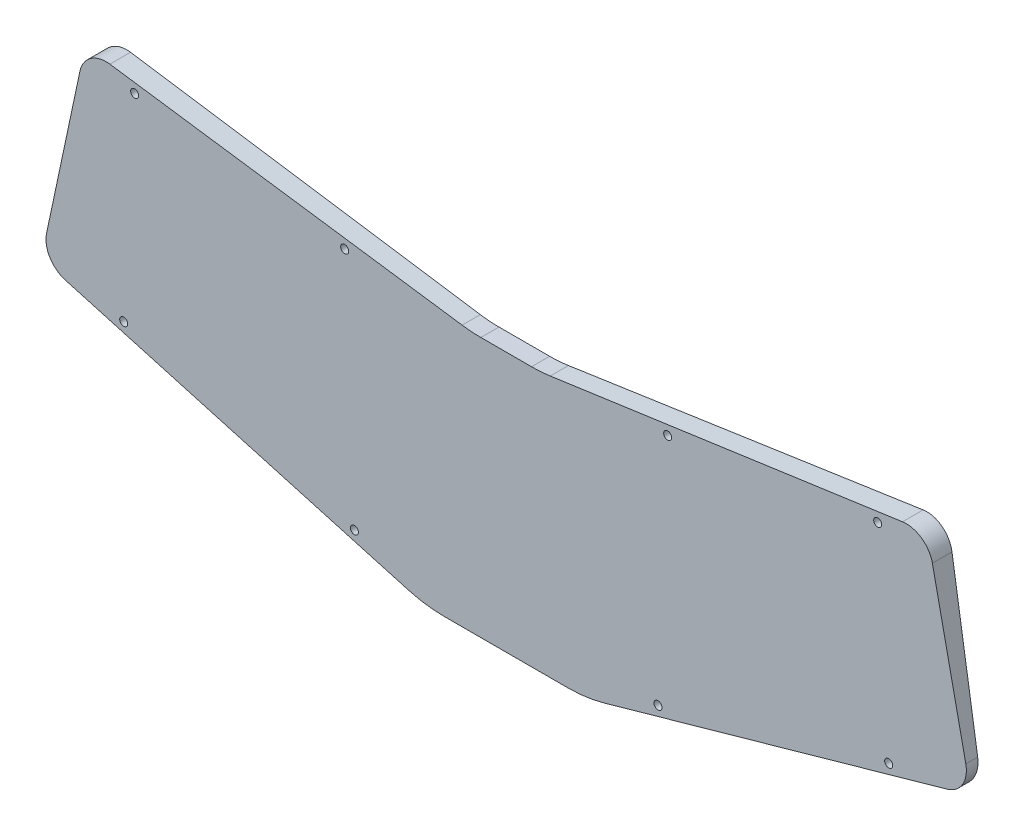
ISO-10303-21;
HEADER;
FILE_DESCRIPTION(('STEP AP214'),'2;1');
FILE_NAME('part.step','',(''),(''),'','','');
FILE_SCHEMA(('AUTOMOTIVE_DESIGN { 1 0 10303 214 1 1 1 1 }'));
ENDSEC;
DATA;
#1=APPLICATION_CONTEXT('core data for automotive mechanical design processes');
#2=APPLICATION_PROTOCOL_DEFINITION('international standard','automotive_design',2000,#1);
#3=PRODUCT_CONTEXT('',#1,'mechanical');
#4=PRODUCT('Part','Part','',(#3));
#5=PRODUCT_RELATED_PRODUCT_CATEGORY('part','',(#4));
#6=PRODUCT_DEFINITION_FORMATION('','',#4);
#7=PRODUCT_DEFINITION_CONTEXT('part definition',#1,'design');
#8=PRODUCT_DEFINITION('design','',#6,#7);
#9=PRODUCT_DEFINITION_SHAPE('','',#8);
#10=(LENGTH_UNIT() NAMED_UNIT(*) SI_UNIT(.MILLI.,.METRE.));
#11=(NAMED_UNIT(*) PLANE_ANGLE_UNIT() SI_UNIT($,.RADIAN.));
#12=(NAMED_UNIT(*) SI_UNIT($,.STERADIAN.) SOLID_ANGLE_UNIT());
#13=UNCERTAINTY_MEASURE_WITH_UNIT(LENGTH_MEASURE(1.E-05),#10,'distance_accuracy_value','');
#14=(GEOMETRIC_REPRESENTATION_CONTEXT(3) GLOBAL_UNCERTAINTY_ASSIGNED_CONTEXT((#13)) GLOBAL_UNIT_ASSIGNED_CONTEXT((#10,
#11,#12)) REPRESENTATION_CONTEXT('',''));
#15=CARTESIAN_POINT('',(0.,0.,0.));
#16=DIRECTION('',(0.,0.,1.));
#17=DIRECTION('',(1.,0.,0.));
#18=AXIS2_PLACEMENT_3D('',#15,#16,#17);
#19=CARTESIAN_POINT('',(150.648829756293,105.6337718,8.));
#20=DIRECTION('',(0.,0.,-1.));
#21=DIRECTION('',(-1.,0.,0.));
#22=AXIS2_PLACEMENT_3D('',#19,#20,#21);
#23=CYLINDRICAL_SURFACE('',#22,50.0000000000001);
#24=DIRECTION('',(0.,0.,-1.));
#25=VECTOR('',#24,1.);
#26=CARTESIAN_POINT('',(150.648829756293,55.6337718,8.));
#27=LINE('',#26,#25);
#28=CARTESIAN_POINT('',(150.648829756293,55.6337718,8.));
#29=VERTEX_POINT('',#28);
#30=CARTESIAN_POINT('',(150.648829756293,55.6337718,1.22268058038461));
#31=VERTEX_POINT('',#30);
#32=EDGE_CURVE('E298',#29,#31,#27,.T.);
#33=ORIENTED_EDGE('',*,*,#32,.T.);
#34=CARTESIAN_POINT('',(150.648829756293,105.6337718,-1.23374664074557));
#35=DIRECTION('',(0.,-0.0490693628638656,-0.998795373251265));
#36=DIRECTION('',(0.,0.998795373251265,-0.0490693628638656));
#37=AXIS2_PLACEMENT_3D('',#34,#35,#36);
#38=ELLIPSE('',#37,50.0603039812257,50.0000000000001);
#39=CARTESIAN_POINT('',(143.638789620378,56.1276172604596,1.19841867174252));
#40=VERTEX_POINT('',#39);
#41=EDGE_CURVE('E56',#31,#40,#38,.T.);
#42=ORIENTED_EDGE('',*,*,#41,.T.);
#43=DIRECTION('',(0.,0.,-1.));
#44=VECTOR('',#43,1.);
#45=CARTESIAN_POINT('',(143.638789620378,56.1276172604596,8.));
#46=LINE('',#45,#44);
#47=CARTESIAN_POINT('',(143.638789620378,56.1276172604596,8.));
#48=VERTEX_POINT('',#47);
#49=EDGE_CURVE('E11',#48,#40,#46,.T.);
#50=ORIENTED_EDGE('',*,*,#49,.F.);
#51=CARTESIAN_POINT('',(150.648829756293,105.6337718,8.));
#52=DIRECTION('',(0.,0.,1.));
#53=DIRECTION('',(1.,0.,0.));
#54=AXIS2_PLACEMENT_3D('',#51,#52,#53);
#55=CIRCLE('',#54,50.0000000000001);
#56=EDGE_CURVE('E242',#48,#29,#55,.T.);
#57=ORIENTED_EDGE('',*,*,#56,.T.);
#58=EDGE_LOOP('',(#33,#42,#50,#57));
#59=FACE_BOUND('',#58,.T.);
#60=ADVANCED_FACE('F41',(#59),#23,.F.);
#61=CARTESIAN_POINT('',(10.6148163678907,74.9637276433423,8.));
#62=DIRECTION('',(-0.140200802718302,-0.990123090790809,0.));
#63=DIRECTION('',(0.990123090790809,-0.140200802718302,0.));
#64=AXIS2_PLACEMENT_3D('',#61,#62,#63);
#65=PLANE('',#64);
#66=DIRECTION('',(0.990099604602698,-0.140197477088937,0.00688769798110076));
#67=VECTOR('',#66,1.);
#68=CARTESIAN_POINT('',(10.6675105079973,74.9562661864687,0.273394556563476));
#69=LINE('',#68,#67);
#70=CARTESIAN_POINT('',(11.8710516632766,74.7858455209533,0.281767075799776));
#71=VERTEX_POINT('',#70);
#72=EDGE_CURVE('E210',#71,#40,#69,.T.);
#73=ORIENTED_EDGE('',*,*,#72,.F.);
#74=DIRECTION('',(0.,0.,-1.));
#75=VECTOR('',#74,1.);
#76=CARTESIAN_POINT('',(11.8710516632766,74.7858455209533,8.));
#77=LINE('',#76,#75);
#78=CARTESIAN_POINT('',(11.8710516632766,74.7858455209533,8.));
#79=VERTEX_POINT('',#78);
#80=EDGE_CURVE('E49',#79,#71,#77,.T.);
#81=ORIENTED_EDGE('',*,*,#80,.F.);
#82=DIRECTION('',(-0.990123090790809,0.140200802718302,0.));
#83=VECTOR('',#82,1.);
#84=CARTESIAN_POINT('',(10.6148163678907,74.9637276433423,8.));
#85=LINE('',#84,#83);
#86=EDGE_CURVE('E209',#48,#79,#85,.T.);
#87=ORIENTED_EDGE('',*,*,#86,.F.);
#88=ORIENTED_EDGE('',*,*,#49,.T.);
#89=EDGE_LOOP('',(#73,#81,#87,#88));
#90=FACE_BOUND('',#89,.T.);
#91=ADVANCED_FACE('F208',(#90),#65,.F.);
#92=CARTESIAN_POINT('',(10.4690436360936,64.8846146130453,8.));
#93=DIRECTION('',(0.,0.,-1.));
#94=DIRECTION('',(-1.,0.,0.));
#95=AXIS2_PLACEMENT_3D('',#92,#93,#94);
#96=CYLINDRICAL_SURFACE('',#95,10.);
#97=CARTESIAN_POINT('',(10.4690436360936,64.8846146130453,0.768200138297392));
#98=DIRECTION('',(0.,-0.0490693628638656,-0.998795373251265));
#99=DIRECTION('',(0.,0.998795373251265,-0.0490693628638656));
#100=AXIS2_PLACEMENT_3D('',#97,#98,#99);
#101=ELLIPSE('',#100,10.0120607962451,10.);
#102=CARTESIAN_POINT('',(0.687567626638668,66.9637315112637,0.666056151403481));
#103=VERTEX_POINT('',#102);
#104=EDGE_CURVE('E203',#103,#71,#101,.T.);
#105=ORIENTED_EDGE('',*,*,#104,.F.);
#106=DIRECTION('',(0.,0.,-1.));
#107=VECTOR('',#106,1.);
#108=CARTESIAN_POINT('',(0.687567626638668,66.9637315112637,8.));
#109=LINE('',#108,#107);
#110=CARTESIAN_POINT('',(0.687567626638668,66.9637315112637,8.));
#111=VERTEX_POINT('',#110);
#112=EDGE_CURVE('E193',#111,#103,#109,.T.);
#113=ORIENTED_EDGE('',*,*,#112,.F.);
#114=CARTESIAN_POINT('',(10.4690436360936,64.8846146130453,8.));
#115=DIRECTION('',(0.,0.,1.));
#116=DIRECTION('',(1.,0.,0.));
#117=AXIS2_PLACEMENT_3D('',#114,#115,#116);
#118=CIRCLE('',#117,10.);
#119=EDGE_CURVE('E204',#79,#111,#118,.T.);
#120=ORIENTED_EDGE('',*,*,#119,.F.);
#121=ORIENTED_EDGE('',*,*,#80,.T.);
#122=EDGE_LOOP('',(#105,#113,#120,#121));
#123=FACE_BOUND('',#122,.T.);
#124=ADVANCED_FACE('F201',(#123),#96,.T.);
#125=CARTESIAN_POINT('',(-12.9604556644015,2.75482987990983,8.));
#126=DIRECTION('',(-0.978147600945494,0.207911689821841,0.));
#127=DIRECTION('',(-0.207911689821841,-0.978147600945495,0.));
#128=AXIS2_PLACEMENT_3D('',#125,#126,#127);
#129=PLANE('',#128);
#130=ORIENTED_EDGE('',*,*,#112,.T.);
#131=DIRECTION('',(-0.20767204165615,-0.977020144963858,0.0479995775936354));
#132=VECTOR('',#131,1.);
#133=CARTESIAN_POINT('',(-13.0021171732661,2.55882788991781,3.83017531999826));
#134=LINE('',#133,#132);
#135=CARTESIAN_POINT('',(-11.8075093074083,8.17901605278993,3.55406365617521));
#136=VERTEX_POINT('',#135);
#137=EDGE_CURVE('E212',#103,#136,#134,.T.);
#138=ORIENTED_EDGE('',*,*,#137,.T.);
#139=DIRECTION('',(0.,0.,-1.));
#140=VECTOR('',#139,1.);
#141=CARTESIAN_POINT('',(-11.8075093074083,8.17901605278993,8.));
#142=LINE('',#141,#140);
#143=CARTESIAN_POINT('',(-11.8075093074083,8.17901605278993,8.));
#144=VERTEX_POINT('',#143);
#145=EDGE_CURVE('E190',#144,#136,#142,.T.);
#146=ORIENTED_EDGE('',*,*,#145,.F.);
#147=DIRECTION('',(0.207911689821841,0.978147600945495,0.));
#148=VECTOR('',#147,1.);
#149=CARTESIAN_POINT('',(-12.9604556644015,2.75482987990983,8.));
#150=LINE('',#149,#148);
#151=EDGE_CURVE('E247',#144,#111,#150,.T.);
#152=ORIENTED_EDGE('',*,*,#151,.T.);
#153=EDGE_LOOP('',(#130,#138,#146,#152));
#154=FACE_BOUND('',#153,.T.);
#155=ADVANCED_FACE('F398',(#154),#129,.T.);
#156=CARTESIAN_POINT('',(-2.02603329795333,6.09989915457152,8.));
#157=DIRECTION('',(0.,0.,-1.));
#158=DIRECTION('',(-1.,0.,0.));
#159=AXIS2_PLACEMENT_3D('',#156,#157,#158);
#160=CYLINDRICAL_SURFACE('',#159,10.);
#161=ORIENTED_EDGE('',*,*,#145,.T.);
#162=CARTESIAN_POINT('',(-2.02603329795333,6.09989915457152,3.65620764306912));
#163=DIRECTION('',(0.,-0.0490693628638656,-0.998795373251265));
#164=DIRECTION('',(0.,0.998795373251265,-0.0490693628638656));
#165=AXIS2_PLACEMENT_3D('',#162,#163,#164);
#166=ELLIPSE('',#165,10.0120607962451,10.);
#167=CARTESIAN_POINT('',(-4.7435049807062,-3.52378764693216,4.12900536760602));
#168=VERTEX_POINT('',#167);
#169=EDGE_CURVE('E219',#168,#136,#166,.T.);
#170=ORIENTED_EDGE('',*,*,#169,.F.);
#171=DIRECTION('',(0.,0.,-1.));
#172=VECTOR('',#171,1.);
#173=CARTESIAN_POINT('',(-4.7435049807062,-3.52378764693216,8.));
#174=LINE('',#173,#172);
#175=CARTESIAN_POINT('',(-4.7435049807062,-3.52378764693216,8.));
#176=VERTEX_POINT('',#175);
#177=EDGE_CURVE('E182',#176,#168,#174,.T.);
#178=ORIENTED_EDGE('',*,*,#177,.F.);
#179=CARTESIAN_POINT('',(-2.02603329795333,6.09989915457152,8.));
#180=DIRECTION('',(0.,0.,1.));
#181=DIRECTION('',(1.,0.,0.));
#182=AXIS2_PLACEMENT_3D('',#179,#180,#181);
#183=CIRCLE('',#182,10.);
#184=EDGE_CURVE('E250',#144,#176,#183,.T.);
#185=ORIENTED_EDGE('',*,*,#184,.F.);
#186=EDGE_LOOP('',(#161,#170,#178,#185));
#187=FACE_BOUND('',#186,.T.);
#188=ADVANCED_FACE('F396',(#187),#160,.T.);
#189=CARTESIAN_POINT('',(-1.27183569305309,-4.50409417349183,8.));
#190=DIRECTION('',(0.271747168275288,0.962368680150368,0.));
#191=DIRECTION('',(-0.962368680150369,0.271747168275288,0.));
#192=AXIS2_PLACEMENT_3D('',#189,#190,#191);
#193=PLANE('',#192);
#194=DIRECTION('',(-0.962282926763274,0.271722953813,-0.013349353207043));
#195=VECTOR('',#194,1.);
#196=CARTESIAN_POINT('',(-1.22272812818722,-4.517960835997,4.17784764928875));
#197=LINE('',#196,#195);
#198=CARTESIAN_POINT('',(123.463014033061,-39.7258786075184,5.90756140155431));
#199=VERTEX_POINT('',#198);
#200=EDGE_CURVE('E176',#199,#168,#197,.T.);
#201=ORIENTED_EDGE('',*,*,#200,.F.);
#202=DIRECTION('',(0.,0.,-1.));
#203=VECTOR('',#202,1.);
#204=CARTESIAN_POINT('',(123.46301403306,-39.7258786075184,8.));
#205=LINE('',#204,#203);
#206=CARTESIAN_POINT('',(123.46301403306,-39.7258786075184,8.));
#207=VERTEX_POINT('',#206);
#208=EDGE_CURVE('E174',#207,#199,#205,.T.);
#209=ORIENTED_EDGE('',*,*,#208,.F.);
#210=DIRECTION('',(0.962368680150369,-0.271747168275288,0.));
#211=VECTOR('',#210,1.);
#212=CARTESIAN_POINT('',(-1.27183569305309,-4.50409417349183,8.));
#213=LINE('',#212,#211);
#214=EDGE_CURVE('E252',#176,#207,#213,.T.);
#215=ORIENTED_EDGE('',*,*,#214,.F.);
#216=ORIENTED_EDGE('',*,*,#177,.T.);
#217=EDGE_LOOP('',(#201,#209,#215,#216));
#218=FACE_BOUND('',#217,.T.);
#219=ADVANCED_FACE('F393',(#218),#193,.F.);
#220=CARTESIAN_POINT('',(137.050372446825,8.39255540000002,8.));
#221=DIRECTION('',(0.,0.,-1.));
#222=DIRECTION('',(-1.,0.,0.));
#223=AXIS2_PLACEMENT_3D('',#220,#221,#222);
#224=CYLINDRICAL_SURFACE('',#223,50.);
#225=CARTESIAN_POINT('',(137.050372446825,8.39255540000002,3.54357277886983));
#226=DIRECTION('',(0.,-0.0490693628638656,-0.998795373251265));
#227=DIRECTION('',(0.,0.998795373251265,-0.0490693628638656));
#228=AXIS2_PLACEMENT_3D('',#225,#226,#227);
#229=ELLIPSE('',#228,50.0603039812256,50.);
#230=CARTESIAN_POINT('',(137.050372446825,-41.6074446,6.));
#231=VERTEX_POINT('',#230);
#232=EDGE_CURVE('E157',#231,#199,#229,.T.);
#233=ORIENTED_EDGE('',*,*,#232,.F.);
#234=DIRECTION('',(0.,0.,-1.));
#235=VECTOR('',#234,1.);
#236=CARTESIAN_POINT('',(137.050372446825,-41.6074446,8.));
#237=LINE('',#236,#235);
#238=CARTESIAN_POINT('',(137.050372446825,-41.6074446,8.));
#239=VERTEX_POINT('',#238);
#240=EDGE_CURVE('E171',#239,#231,#237,.T.);
#241=ORIENTED_EDGE('',*,*,#240,.F.);
#242=CARTESIAN_POINT('',(137.050372446825,8.39255540000002,8.));
#243=DIRECTION('',(0.,0.,1.));
#244=DIRECTION('',(1.,0.,0.));
#245=AXIS2_PLACEMENT_3D('',#242,#243,#244);
#246=CIRCLE('',#245,50.);
#247=EDGE_CURVE('E254',#207,#239,#246,.T.);
#248=ORIENTED_EDGE('',*,*,#247,.F.);
#249=ORIENTED_EDGE('',*,*,#208,.T.);
#250=EDGE_LOOP('',(#233,#241,#248,#249));
#251=FACE_BOUND('',#250,.T.);
#252=ADVANCED_FACE('F169',(#251),#224,.T.);
#253=CARTESIAN_POINT('',(0.,-41.6074446,8.));
#254=DIRECTION('',(0.,1.,0.));
#255=DIRECTION('',(0.,0.,1.));
#256=AXIS2_PLACEMENT_3D('',#253,#254,#255);
#257=PLANE('',#256);
#258=DIRECTION('',(1.,0.,0.));
#259=VECTOR('',#258,1.);
#260=CARTESIAN_POINT('',(-12.0260332979533,-41.6074446,6.));
#261=LINE('',#260,#259);
#262=CARTESIAN_POINT('',(183.202456353175,-41.6074446,6.));
#263=VERTEX_POINT('',#262);
#264=EDGE_CURVE('E154',#231,#263,#261,.T.);
#265=ORIENTED_EDGE('',*,*,#264,.T.);
#266=DIRECTION('',(0.,0.,-1.));
#267=VECTOR('',#266,1.);
#268=CARTESIAN_POINT('',(183.202456353175,-41.6074446,8.));
#269=LINE('',#268,#267);
#270=CARTESIAN_POINT('',(183.202456353175,-41.6074446,8.));
#271=VERTEX_POINT('',#270);
#272=EDGE_CURVE('E180',#271,#263,#269,.T.);
#273=ORIENTED_EDGE('',*,*,#272,.F.);
#274=DIRECTION('',(1.,0.,0.));
#275=VECTOR('',#274,1.);
#276=CARTESIAN_POINT('',(0.,-41.6074446,8.));
#277=LINE('',#276,#275);
#278=EDGE_CURVE('E179',#239,#271,#277,.T.);
#279=ORIENTED_EDGE('',*,*,#278,.F.);
#280=ORIENTED_EDGE('',*,*,#240,.T.);
#281=EDGE_LOOP('',(#265,#273,#279,#280));
#282=FACE_BOUND('',#281,.T.);
#283=ADVANCED_FACE('F178',(#282),#257,.F.);
#284=CARTESIAN_POINT('',(183.202456353175,8.3925554,8.));
#285=DIRECTION('',(0.,0.,-1.));
#286=DIRECTION('',(-1.,0.,0.));
#287=AXIS2_PLACEMENT_3D('',#284,#285,#286);
#288=CYLINDRICAL_SURFACE('',#287,50.);
#289=CARTESIAN_POINT('',(183.202456353175,8.3925554,3.54357277886983));
#290=DIRECTION('',(0.,-0.0490693628638656,-0.998795373251265));
#291=DIRECTION('',(0.,0.998795373251265,-0.0490693628638656));
#292=AXIS2_PLACEMENT_3D('',#289,#290,#291);
#293=ELLIPSE('',#292,50.0603039812256,50.);
#294=CARTESIAN_POINT('',(196.789814766939,-39.7258786075184,5.90756140155431));
#295=VERTEX_POINT('',#294);
#296=EDGE_CURVE('E160',#295,#263,#293,.T.);
#297=ORIENTED_EDGE('',*,*,#296,.F.);
#298=DIRECTION('',(0.,0.,-1.));
#299=VECTOR('',#298,1.);
#300=CARTESIAN_POINT('',(196.789814766939,-39.7258786075184,8.));
#301=LINE('',#300,#299);
#302=CARTESIAN_POINT('',(196.789814766939,-39.7258786075184,8.));
#303=VERTEX_POINT('',#302);
#304=EDGE_CURVE('E184',#303,#295,#301,.T.);
#305=ORIENTED_EDGE('',*,*,#304,.F.);
#306=CARTESIAN_POINT('',(183.202456353175,8.3925554,8.));
#307=DIRECTION('',(0.,0.,1.));
#308=DIRECTION('',(1.,0.,0.));
#309=AXIS2_PLACEMENT_3D('',#306,#307,#308);
#310=CIRCLE('',#309,50.);
#311=EDGE_CURVE('E257',#271,#303,#310,.T.);
#312=ORIENTED_EDGE('',*,*,#311,.F.);
#313=ORIENTED_EDGE('',*,*,#272,.T.);
#314=EDGE_LOOP('',(#297,#305,#312,#313));
#315=FACE_BOUND('',#314,.T.);
#316=ADVANCED_FACE('F328',(#315),#288,.T.);
#317=CARTESIAN_POINT('',(24.9213937299691,-88.2569225785712,8.));
#318=DIRECTION('',(-0.271747168275288,0.962368680150369,0.));
#319=DIRECTION('',(-0.962368680150369,-0.271747168275288,0.));
#320=AXIS2_PLACEMENT_3D('',#317,#318,#319);
#321=PLANE('',#320);
#322=DIRECTION('',(-0.962282926763274,-0.271722953812999,0.013349353207043));
#323=VECTOR('',#322,1.);
#324=CARTESIAN_POINT('',(24.9251424194987,-88.2558640489397,8.29176894714147));
#325=LINE('',#324,#323);
#326=CARTESIAN_POINT('',(324.996333780706,-3.52378764693226,4.12900536760602));
#327=VERTEX_POINT('',#326);
#328=EDGE_CURVE('E325',#327,#295,#325,.T.);
#329=ORIENTED_EDGE('',*,*,#328,.F.);
#330=DIRECTION('',(0.,0.,-1.));
#331=VECTOR('',#330,1.);
#332=CARTESIAN_POINT('',(324.996333780706,-3.52378764693226,8.));
#333=LINE('',#332,#331);
#334=CARTESIAN_POINT('',(324.996333780706,-3.52378764693226,8.));
#335=VERTEX_POINT('',#334);
#336=EDGE_CURVE('E316',#335,#327,#333,.T.);
#337=ORIENTED_EDGE('',*,*,#336,.F.);
#338=DIRECTION('',(0.962368680150369,0.271747168275288,0.));
#339=VECTOR('',#338,1.);
#340=CARTESIAN_POINT('',(24.9213937299691,-88.2569225785712,8.));
#341=LINE('',#340,#339);
#342=EDGE_CURVE('E259',#303,#335,#341,.T.);
#343=ORIENTED_EDGE('',*,*,#342,.F.);
#344=ORIENTED_EDGE('',*,*,#304,.T.);
#345=EDGE_LOOP('',(#329,#337,#343,#344));
#346=FACE_BOUND('',#345,.T.);
#347=ADVANCED_FACE('F323',(#346),#321,.F.);
#348=CARTESIAN_POINT('',(322.278862097953,6.09989915457145,8.));
#349=DIRECTION('',(0.,0.,-1.));
#350=DIRECTION('',(-1.,0.,0.));
#351=AXIS2_PLACEMENT_3D('',#348,#349,#350);
#352=CYLINDRICAL_SURFACE('',#351,9.99999999999997);
#353=ORIENTED_EDGE('',*,*,#336,.T.);
#354=CARTESIAN_POINT('',(322.278862097953,6.09989915457145,3.65620764306912));
#355=DIRECTION('',(0.,-0.0490693628638656,-0.998795373251265));
#356=DIRECTION('',(0.,0.998795373251265,-0.0490693628638656));
#357=AXIS2_PLACEMENT_3D('',#354,#355,#356);
#358=ELLIPSE('',#357,10.0120607962451,9.99999999999997);
#359=CARTESIAN_POINT('',(332.060338107408,8.17901605278988,3.55406365617521));
#360=VERTEX_POINT('',#359);
#361=EDGE_CURVE('E329',#360,#327,#358,.T.);
#362=ORIENTED_EDGE('',*,*,#361,.F.);
#363=DIRECTION('',(0.,0.,-1.));
#364=VECTOR('',#363,1.);
#365=CARTESIAN_POINT('',(332.060338107408,8.17901605278988,8.));
#366=LINE('',#365,#364);
#367=CARTESIAN_POINT('',(332.060338107408,8.17901605278988,8.));
#368=VERTEX_POINT('',#367);
#369=EDGE_CURVE('E313',#368,#360,#366,.T.);
#370=ORIENTED_EDGE('',*,*,#369,.F.);
#371=CARTESIAN_POINT('',(322.278862097953,6.09989915457145,8.));
#372=DIRECTION('',(0.,0.,1.));
#373=DIRECTION('',(1.,0.,0.));
#374=AXIS2_PLACEMENT_3D('',#371,#372,#373);
#375=CIRCLE('',#374,9.99999999999997);
#376=EDGE_CURVE('E261',#335,#368,#375,.T.);
#377=ORIENTED_EDGE('',*,*,#376,.F.);
#378=EDGE_LOOP('',(#353,#362,#370,#377));
#379=FACE_BOUND('',#378,.T.);
#380=ADVANCED_FACE('F386',(#379),#352,.T.);
#381=CARTESIAN_POINT('',(319.369628720743,67.8841098428497,8.));
#382=DIRECTION('',(0.978147600945494,0.207911689821841,0.));
#383=DIRECTION('',(-0.207911689821841,0.978147600945495,0.));
#384=AXIS2_PLACEMENT_3D('',#381,#382,#383);
#385=PLANE('',#384);
#386=ORIENTED_EDGE('',*,*,#369,.T.);
#387=DIRECTION('',(-0.20767204165615,0.977020144963858,-0.0479995775936354));
#388=VECTOR('',#387,1.);
#389=CARTESIAN_POINT('',(319.44318545107,67.5380526328695,0.637840590667829));
#390=LINE('',#389,#388);
#391=CARTESIAN_POINT('',(319.565261173604,66.9637315101226,0.66605615145954));
#392=VERTEX_POINT('',#391);
#393=EDGE_CURVE('E333',#360,#392,#390,.T.);
#394=ORIENTED_EDGE('',*,*,#393,.T.);
#395=DIRECTION('',(0.,0.,-1.));
#396=VECTOR('',#395,1.);
#397=CARTESIAN_POINT('',(319.565261173604,66.9637315101226,8.));
#398=LINE('',#397,#396);
#399=CARTESIAN_POINT('',(319.565261173604,66.9637315101226,8.));
#400=VERTEX_POINT('',#399);
#401=EDGE_CURVE('E310',#400,#392,#398,.T.);
#402=ORIENTED_EDGE('',*,*,#401,.F.);
#403=DIRECTION('',(0.207911689821841,-0.978147600945495,0.));
#404=VECTOR('',#403,1.);
#405=CARTESIAN_POINT('',(319.369628720743,67.8841098428497,8.));
#406=LINE('',#405,#404);
#407=EDGE_CURVE('E263',#400,#368,#406,.T.);
#408=ORIENTED_EDGE('',*,*,#407,.T.);
#409=EDGE_LOOP('',(#386,#394,#402,#408));
#410=FACE_BOUND('',#409,.T.);
#411=ADVANCED_FACE('F382',(#410),#385,.T.);
#412=CARTESIAN_POINT('',(309.783785164149,64.8846146119043,8.));
#413=DIRECTION('',(0.,0.,-1.));
#414=DIRECTION('',(-1.,0.,0.));
#415=AXIS2_PLACEMENT_3D('',#412,#413,#414);
#416=CYLINDRICAL_SURFACE('',#415,9.99999999999994);
#417=CARTESIAN_POINT('',(309.783785164149,64.8846146119043,0.768200138353446));
#418=DIRECTION('',(0.,-0.0490693628638656,-0.998795373251265));
#419=DIRECTION('',(0.,0.998795373251265,-0.0490693628638656));
#420=AXIS2_PLACEMENT_3D('',#417,#418,#419);
#421=ELLIPSE('',#420,10.0120607962451,9.99999999999994);
#422=CARTESIAN_POINT('',(308.38177713705,74.7858455198242,0.281767075855245));
#423=VERTEX_POINT('',#422);
#424=EDGE_CURVE('E336',#423,#392,#421,.T.);
#425=ORIENTED_EDGE('',*,*,#424,.F.);
#426=DIRECTION('',(0.,0.,-1.));
#427=VECTOR('',#426,1.);
#428=CARTESIAN_POINT('',(308.38177713705,74.7858455198242,8.));
#429=LINE('',#428,#427);
#430=CARTESIAN_POINT('',(308.38177713705,74.7858455198242,8.));
#431=VERTEX_POINT('',#430);
#432=EDGE_CURVE('E307',#431,#423,#429,.T.);
#433=ORIENTED_EDGE('',*,*,#432,.F.);
#434=CARTESIAN_POINT('',(309.783785164149,64.8846146119043,8.));
#435=DIRECTION('',(0.,0.,1.));
#436=DIRECTION('',(1.,0.,0.));
#437=AXIS2_PLACEMENT_3D('',#434,#435,#436);
#438=CIRCLE('',#437,9.99999999999994);
#439=EDGE_CURVE('E266',#400,#431,#438,.T.);
#440=ORIENTED_EDGE('',*,*,#439,.F.);
#441=ORIENTED_EDGE('',*,*,#401,.T.);
#442=EDGE_LOOP('',(#425,#433,#440,#441));
#443=FACE_BOUND('',#442,.T.);
#444=ADVANCED_FACE('F378',(#443),#416,.T.);
#445=CARTESIAN_POINT('',(-4.31984187141743,30.5074942709976,8.));
#446=DIRECTION('',(0.140200802709867,-0.990123090792003,0.));
#447=DIRECTION('',(0.990123090792003,0.140200802709867,0.));
#448=AXIS2_PLACEMENT_3D('',#445,#446,#447);
#449=PLANE('',#448);
#450=DIRECTION('',(0.990099604603895,0.140197477080502,-0.00688769798068639));
#451=VECTOR('',#450,1.);
#452=CARTESIAN_POINT('',(-4.35764173051797,30.5021418348839,2.45736097953825));
#453=LINE('',#452,#451);
#454=CARTESIAN_POINT('',(176.614039179414,56.1276172603999,1.19841867174545));
#455=VERTEX_POINT('',#454);
#456=EDGE_CURVE('E338',#455,#423,#453,.T.);
#457=ORIENTED_EDGE('',*,*,#456,.F.);
#458=DIRECTION('',(0.,0.,-1.));
#459=VECTOR('',#458,1.);
#460=CARTESIAN_POINT('',(176.614039179414,56.1276172603999,8.));
#461=LINE('',#460,#459);
#462=CARTESIAN_POINT('',(176.614039179414,56.1276172603999,8.));
#463=VERTEX_POINT('',#462);
#464=EDGE_CURVE('E304',#463,#455,#461,.T.);
#465=ORIENTED_EDGE('',*,*,#464,.F.);
#466=DIRECTION('',(-0.990123090792003,-0.140200802709867,0.));
#467=VECTOR('',#466,1.);
#468=CARTESIAN_POINT('',(-4.31984187141743,30.5074942709976,8.));
#469=LINE('',#468,#467);
#470=EDGE_CURVE('E268',#431,#463,#469,.T.);
#471=ORIENTED_EDGE('',*,*,#470,.F.);
#472=ORIENTED_EDGE('',*,*,#432,.T.);
#473=EDGE_LOOP('',(#457,#465,#471,#472));
#474=FACE_BOUND('',#473,.T.);
#475=ADVANCED_FACE('F373',(#474),#449,.F.);
#476=CARTESIAN_POINT('',(169.603999043921,105.6337718,8.));
#477=DIRECTION('',(0.,0.,-1.));
#478=DIRECTION('',(-1.,0.,0.));
#479=AXIS2_PLACEMENT_3D('',#476,#477,#478);
#480=CYLINDRICAL_SURFACE('',#479,50.);
#481=ORIENTED_EDGE('',*,*,#464,.T.);
#482=CARTESIAN_POINT('',(169.603999043921,105.6337718,-1.23374664074557));
#483=DIRECTION('',(0.,-0.0490693628638656,-0.998795373251265));
#484=DIRECTION('',(0.,0.998795373251265,-0.0490693628638656));
#485=AXIS2_PLACEMENT_3D('',#482,#483,#484);
#486=ELLIPSE('',#485,50.0603039812256,50.);
#487=CARTESIAN_POINT('',(169.603999043921,55.6337718,1.22268058038461));
#488=VERTEX_POINT('',#487);
#489=EDGE_CURVE('E340',#455,#488,#486,.T.);
#490=ORIENTED_EDGE('',*,*,#489,.T.);
#491=DIRECTION('',(0.,0.,-1.));
#492=VECTOR('',#491,1.);
#493=CARTESIAN_POINT('',(169.603999043921,55.6337718,8.));
#494=LINE('',#493,#492);
#495=CARTESIAN_POINT('',(169.603999043921,55.6337718,8.));
#496=VERTEX_POINT('',#495);
#497=EDGE_CURVE('E301',#496,#488,#494,.T.);
#498=ORIENTED_EDGE('',*,*,#497,.F.);
#499=CARTESIAN_POINT('',(169.603999043921,105.6337718,8.));
#500=DIRECTION('',(0.,0.,1.));
#501=DIRECTION('',(1.,0.,0.));
#502=AXIS2_PLACEMENT_3D('',#499,#500,#501);
#503=CIRCLE('',#502,50.);
#504=EDGE_CURVE('E270',#496,#463,#503,.T.);
#505=ORIENTED_EDGE('',*,*,#504,.T.);
#506=EDGE_LOOP('',(#481,#490,#498,#505));
#507=FACE_BOUND('',#506,.T.);
#508=ADVANCED_FACE('F368',(#507),#480,.F.);
#509=CARTESIAN_POINT('',(299.106474889683,69.9375545698398,8.));
#510=DIRECTION('',(0.,0.,-1.));
#511=DIRECTION('',(-1.,0.,0.));
#512=AXIS2_PLACEMENT_3D('',#509,#510,#511);
#513=CYLINDRICAL_SURFACE('',#512,1.5);
#514=CARTESIAN_POINT('',(299.106474889683,69.9375545698398,8.));
#515=DIRECTION('',(0.,0.,1.));
#516=DIRECTION('',(1.,0.,0.));
#517=AXIS2_PLACEMENT_3D('',#514,#515,#516);
#518=CIRCLE('',#517,1.5);
#519=CARTESIAN_POINT('',(300.606474889683,69.9375545698398,8.));
#520=VERTEX_POINT('',#519);
#521=EDGE_CURVE('E292',#520,#520,#518,.T.);
#522=ORIENTED_EDGE('',*,*,#521,.T.);
#523=EDGE_LOOP('',(#522));
#524=FACE_BOUND('',#523,.T.);
#525=CARTESIAN_POINT('',(299.106474889683,69.9375545698398,0.519956553165263));
#526=DIRECTION('',(0.,-0.0490693628638656,-0.998795373251265));
#527=DIRECTION('',(0.,0.998795373251265,-0.0490693628638656));
#528=AXIS2_PLACEMENT_3D('',#525,#526,#527);
#529=ELLIPSE('',#528,1.50180911943677,1.5);
#530=CARTESIAN_POINT('',(299.106474889683,71.4375545698398,0.446263736531358));
#531=VERTEX_POINT('',#530);
#532=EDGE_CURVE('E239',#531,#531,#529,.T.);
#533=ORIENTED_EDGE('',*,*,#532,.T.);
#534=EDGE_LOOP('',(#533));
#535=FACE_BOUND('',#534,.T.);
#536=ADVANCED_FACE('F428',(#524,#535),#513,.F.);
#537=CARTESIAN_POINT('',(303.213547748467,-6.03780381486214,8.));
#538=DIRECTION('',(0.,0.,-1.));
#539=DIRECTION('',(-1.,0.,0.));
#540=AXIS2_PLACEMENT_3D('',#537,#538,#539);
#541=CYLINDRICAL_SURFACE('',#540,1.5);
#542=CARTESIAN_POINT('',(303.213547748467,-6.03780381486214,8.));
#543=DIRECTION('',(0.,0.,1.));
#544=DIRECTION('',(1.,0.,0.));
#545=AXIS2_PLACEMENT_3D('',#542,#543,#544);
#546=CIRCLE('',#545,1.5);
#547=CARTESIAN_POINT('',(304.713547748467,-6.03780381486214,8.));
#548=VERTEX_POINT('',#547);
#549=EDGE_CURVE('E289',#548,#548,#546,.T.);
#550=ORIENTED_EDGE('',*,*,#549,.T.);
#551=EDGE_LOOP('',(#550));
#552=FACE_BOUND('',#551,.T.);
#553=CARTESIAN_POINT('',(303.213547748467,-6.03780381486214,4.25251532259131));
#554=DIRECTION('',(0.,-0.0490693628638656,-0.998795373251265));
#555=DIRECTION('',(0.,0.998795373251265,-0.0490693628638656));
#556=AXIS2_PLACEMENT_3D('',#553,#554,#555);
#557=ELLIPSE('',#556,1.50180911943677,1.5);
#558=CARTESIAN_POINT('',(303.213547748467,-4.53780381486214,4.1788225059574));
#559=VERTEX_POINT('',#558);
#560=EDGE_CURVE('E236',#559,#559,#557,.T.);
#561=ORIENTED_EDGE('',*,*,#560,.T.);
#562=EDGE_LOOP('',(#561));
#563=FACE_BOUND('',#562,.T.);
#564=ADVANCED_FACE('F450',(#552,#563),#541,.F.);
#565=CARTESIAN_POINT('',(17.0392810515326,-6.03780381486207,8.));
#566=DIRECTION('',(0.,0.,-1.));
#567=DIRECTION('',(-1.,0.,0.));
#568=AXIS2_PLACEMENT_3D('',#565,#566,#567);
#569=CYLINDRICAL_SURFACE('',#568,1.5);
#570=CARTESIAN_POINT('',(17.0392810515326,-6.03780381486207,8.));
#571=DIRECTION('',(0.,0.,1.));
#572=DIRECTION('',(1.,0.,0.));
#573=AXIS2_PLACEMENT_3D('',#570,#571,#572);
#574=CIRCLE('',#573,1.5);
#575=CARTESIAN_POINT('',(18.5392810515326,-6.03780381486207,8.));
#576=VERTEX_POINT('',#575);
#577=EDGE_CURVE('E286',#576,#576,#574,.T.);
#578=ORIENTED_EDGE('',*,*,#577,.T.);
#579=EDGE_LOOP('',(#578));
#580=FACE_BOUND('',#579,.T.);
#581=CARTESIAN_POINT('',(17.0392810515326,-6.03780381486207,4.2525153225913));
#582=DIRECTION('',(0.,-0.0490693628638656,-0.998795373251265));
#583=DIRECTION('',(0.,0.998795373251265,-0.0490693628638656));
#584=AXIS2_PLACEMENT_3D('',#581,#582,#583);
#585=ELLIPSE('',#584,1.50180911943677,1.5);
#586=CARTESIAN_POINT('',(17.0392810515326,-4.53780381486207,4.1788225059574));
#587=VERTEX_POINT('',#586);
#588=EDGE_CURVE('E233',#587,#587,#585,.T.);
#589=ORIENTED_EDGE('',*,*,#588,.T.);
#590=EDGE_LOOP('',(#589));
#591=FACE_BOUND('',#590,.T.);
#592=ADVANCED_FACE('F446',(#580,#591),#569,.F.);
#593=CARTESIAN_POINT('',(220.534486148486,58.8118107158965,8.));
#594=DIRECTION('',(0.,0.,-1.));
#595=DIRECTION('',(-1.,0.,0.));
#596=AXIS2_PLACEMENT_3D('',#593,#594,#595);
#597=CYLINDRICAL_SURFACE('',#596,1.5);
#598=CARTESIAN_POINT('',(220.534486148486,58.8118107158965,8.));
#599=DIRECTION('',(0.,0.,1.));
#600=DIRECTION('',(1.,0.,0.));
#601=AXIS2_PLACEMENT_3D('',#598,#599,#600);
#602=CIRCLE('',#601,1.5);
#603=CARTESIAN_POINT('',(222.034486148486,58.8118107158965,8.));
#604=VERTEX_POINT('',#603);
#605=EDGE_CURVE('E283',#604,#604,#602,.T.);
#606=ORIENTED_EDGE('',*,*,#605,.T.);
#607=EDGE_LOOP('',(#606));
#608=FACE_BOUND('',#607,.T.);
#609=CARTESIAN_POINT('',(220.534486148486,58.8118107158965,1.06654815432822));
#610=DIRECTION('',(0.,-0.0490693628638656,-0.998795373251265));
#611=DIRECTION('',(0.,0.998795373251265,-0.0490693628638656));
#612=AXIS2_PLACEMENT_3D('',#609,#610,#611);
#613=ELLIPSE('',#612,1.50180911943677,1.5);
#614=CARTESIAN_POINT('',(220.534486148486,60.3118107158965,0.992855337694317));
#615=VERTEX_POINT('',#614);
#616=EDGE_CURVE('E230',#615,#615,#613,.T.);
#617=ORIENTED_EDGE('',*,*,#616,.T.);
#618=EDGE_LOOP('',(#617));
#619=FACE_BOUND('',#618,.T.);
#620=ADVANCED_FACE('F442',(#608,#619),#597,.F.);
#621=CARTESIAN_POINT('',(99.7183426515377,58.811810716097,8.));
#622=DIRECTION('',(0.,0.,-1.));
#623=DIRECTION('',(-1.,0.,0.));
#624=AXIS2_PLACEMENT_3D('',#621,#622,#623);
#625=CYLINDRICAL_SURFACE('',#624,1.5);
#626=CARTESIAN_POINT('',(99.7183426515377,58.811810716097,8.));
#627=DIRECTION('',(0.,0.,1.));
#628=DIRECTION('',(1.,0.,0.));
#629=AXIS2_PLACEMENT_3D('',#626,#627,#628);
#630=CIRCLE('',#629,1.5);
#631=CARTESIAN_POINT('',(101.218342651538,58.811810716097,8.));
#632=VERTEX_POINT('',#631);
#633=EDGE_CURVE('E280',#632,#632,#630,.T.);
#634=ORIENTED_EDGE('',*,*,#633,.T.);
#635=EDGE_LOOP('',(#634));
#636=FACE_BOUND('',#635,.T.);
#637=CARTESIAN_POINT('',(99.7183426515377,58.811810716097,1.06654815431837));
#638=DIRECTION('',(0.,-0.0490693628638656,-0.998795373251265));
#639=DIRECTION('',(0.,0.998795373251265,-0.0490693628638656));
#640=AXIS2_PLACEMENT_3D('',#637,#638,#639);
#641=ELLIPSE('',#640,1.50180911943677,1.5);
#642=CARTESIAN_POINT('',(99.7183426515377,60.311810716097,0.992855337684468));
#643=VERTEX_POINT('',#642);
#644=EDGE_CURVE('E227',#643,#643,#641,.T.);
#645=ORIENTED_EDGE('',*,*,#644,.T.);
#646=EDGE_LOOP('',(#645));
#647=FACE_BOUND('',#646,.T.);
#648=ADVANCED_FACE('F438',(#636,#647),#625,.F.);
#649=CARTESIAN_POINT('',(216.917253445821,-30.4055685739259,8.));
#650=DIRECTION('',(0.,0.,-1.));
#651=DIRECTION('',(-1.,0.,0.));
#652=AXIS2_PLACEMENT_3D('',#649,#650,#651);
#653=CYLINDRICAL_SURFACE('',#652,1.5);
#654=CARTESIAN_POINT('',(216.917253445821,-30.4055685739259,8.));
#655=DIRECTION('',(0.,0.,1.));
#656=DIRECTION('',(1.,0.,0.));
#657=AXIS2_PLACEMENT_3D('',#654,#655,#656);
#658=CIRCLE('',#657,1.5);
#659=CARTESIAN_POINT('',(218.417253445821,-30.4055685739259,8.));
#660=VERTEX_POINT('',#659);
#661=EDGE_CURVE('E277',#660,#660,#658,.T.);
#662=ORIENTED_EDGE('',*,*,#661,.T.);
#663=EDGE_LOOP('',(#662));
#664=FACE_BOUND('',#663,.T.);
#665=CARTESIAN_POINT('',(216.917253445821,-30.4055685739259,5.44966813603652));
#666=DIRECTION('',(0.,-0.0490693628638656,-0.998795373251265));
#667=DIRECTION('',(0.,0.998795373251265,-0.0490693628638656));
#668=AXIS2_PLACEMENT_3D('',#665,#666,#667);
#669=ELLIPSE('',#668,1.50180911943677,1.5);
#670=CARTESIAN_POINT('',(216.917253445821,-28.9055685739259,5.37597531940262));
#671=VERTEX_POINT('',#670);
#672=EDGE_CURVE('E224',#671,#671,#669,.T.);
#673=ORIENTED_EDGE('',*,*,#672,.T.);
#674=EDGE_LOOP('',(#673));
#675=FACE_BOUND('',#674,.T.);
#676=ADVANCED_FACE('F434',(#664,#675),#653,.F.);
#677=CARTESIAN_POINT('',(103.335575354179,-30.4055685739259,8.));
#678=DIRECTION('',(0.,0.,-1.));
#679=DIRECTION('',(-1.,0.,0.));
#680=AXIS2_PLACEMENT_3D('',#677,#678,#679);
#681=CYLINDRICAL_SURFACE('',#680,1.5);
#682=CARTESIAN_POINT('',(103.335575354179,-30.4055685739259,8.));
#683=DIRECTION('',(0.,0.,1.));
#684=DIRECTION('',(1.,0.,0.));
#685=AXIS2_PLACEMENT_3D('',#682,#683,#684);
#686=CIRCLE('',#685,1.5);
#687=CARTESIAN_POINT('',(104.835575354179,-30.4055685739259,8.));
#688=VERTEX_POINT('',#687);
#689=EDGE_CURVE('E274',#688,#688,#686,.T.);
#690=ORIENTED_EDGE('',*,*,#689,.T.);
#691=EDGE_LOOP('',(#690));
#692=FACE_BOUND('',#691,.T.);
#693=CARTESIAN_POINT('',(103.335575354179,-30.4055685739259,5.44966813603652));
#694=DIRECTION('',(0.,-0.0490693628638656,-0.998795373251265));
#695=DIRECTION('',(0.,0.998795373251265,-0.0490693628638656));
#696=AXIS2_PLACEMENT_3D('',#693,#694,#695);
#697=ELLIPSE('',#696,1.50180911943677,1.5);
#698=CARTESIAN_POINT('',(103.335575354179,-28.9055685739259,5.37597531940262));
#699=VERTEX_POINT('',#698);
#700=EDGE_CURVE('E175',#699,#699,#697,.T.);
#701=ORIENTED_EDGE('',*,*,#700,.T.);
#702=EDGE_LOOP('',(#701));
#703=FACE_BOUND('',#702,.T.);
#704=ADVANCED_FACE('F431',(#692,#703),#681,.F.);
#705=CARTESIAN_POINT('',(0.,55.6337718,8.));
#706=DIRECTION('',(0.,-1.,0.));
#707=DIRECTION('',(0.,0.,-1.));
#708=AXIS2_PLACEMENT_3D('',#705,#706,#707);
#709=PLANE('',#708);
#710=DIRECTION('',(1.,0.,0.));
#711=VECTOR('',#710,1.);
#712=CARTESIAN_POINT('',(0.,55.6337718,1.22268058038461));
#713=LINE('',#712,#711);
#714=EDGE_CURVE('E343',#31,#488,#713,.T.);
#715=ORIENTED_EDGE('',*,*,#714,.F.);
#716=ORIENTED_EDGE('',*,*,#32,.F.);
#717=DIRECTION('',(-1.,0.,0.));
#718=VECTOR('',#717,1.);
#719=CARTESIAN_POINT('',(0.,55.6337718,8.));
#720=LINE('',#719,#718);
#721=EDGE_CURVE('E64',#496,#29,#720,.T.);
#722=ORIENTED_EDGE('',*,*,#721,.F.);
#723=ORIENTED_EDGE('',*,*,#497,.T.);
#724=EDGE_LOOP('',(#715,#716,#722,#723));
#725=FACE_BOUND('',#724,.T.);
#726=ADVANCED_FACE('F366',(#725),#709,.F.);
#727=CARTESIAN_POINT('',(21.1463539105427,69.9375545708984,8.));
#728=DIRECTION('',(0.,0.,-1.));
#729=DIRECTION('',(-1.,0.,0.));
#730=AXIS2_PLACEMENT_3D('',#727,#728,#729);
#731=CYLINDRICAL_SURFACE('',#730,1.5);
#732=CARTESIAN_POINT('',(21.1463539105427,69.9375545708984,8.));
#733=DIRECTION('',(0.,0.,1.));
#734=DIRECTION('',(1.,0.,0.));
#735=AXIS2_PLACEMENT_3D('',#732,#733,#734);
#736=CIRCLE('',#735,1.5);
#737=CARTESIAN_POINT('',(22.6463539105427,69.9375545708984,8.));
#738=VERTEX_POINT('',#737);
#739=EDGE_CURVE('E295',#738,#738,#736,.T.);
#740=ORIENTED_EDGE('',*,*,#739,.T.);
#741=EDGE_LOOP('',(#740));
#742=FACE_BOUND('',#741,.T.);
#743=CARTESIAN_POINT('',(21.1463539105427,69.9375545708984,0.519956553113258));
#744=DIRECTION('',(0.,-0.0490693628638656,-0.998795373251265));
#745=DIRECTION('',(0.,0.998795373251265,-0.0490693628638656));
#746=AXIS2_PLACEMENT_3D('',#743,#744,#745);
#747=ELLIPSE('',#746,1.50180911943677,1.5);
#748=CARTESIAN_POINT('',(21.1463539105427,71.4375545708984,0.446263736479352));
#749=VERTEX_POINT('',#748);
#750=EDGE_CURVE('E44',#749,#749,#747,.T.);
#751=ORIENTED_EDGE('',*,*,#750,.T.);
#752=EDGE_LOOP('',(#751));
#753=FACE_BOUND('',#752,.T.);
#754=ADVANCED_FACE('F347',(#742,#753),#731,.F.);
#755=CARTESIAN_POINT('',(0.,0.,8.));
#756=DIRECTION('',(0.,0.,1.));
#757=DIRECTION('',(1.,0.,0.));
#758=AXIS2_PLACEMENT_3D('',#755,#756,#757);
#759=PLANE('',#758);
#760=ORIENTED_EDGE('',*,*,#56,.F.);
#761=ORIENTED_EDGE('',*,*,#86,.T.);
#762=ORIENTED_EDGE('',*,*,#119,.T.);
#763=ORIENTED_EDGE('',*,*,#151,.F.);
#764=ORIENTED_EDGE('',*,*,#184,.T.);
#765=ORIENTED_EDGE('',*,*,#214,.T.);
#766=ORIENTED_EDGE('',*,*,#247,.T.);
#767=ORIENTED_EDGE('',*,*,#278,.T.);
#768=ORIENTED_EDGE('',*,*,#311,.T.);
#769=ORIENTED_EDGE('',*,*,#342,.T.);
#770=ORIENTED_EDGE('',*,*,#376,.T.);
#771=ORIENTED_EDGE('',*,*,#407,.F.);
#772=ORIENTED_EDGE('',*,*,#439,.T.);
#773=ORIENTED_EDGE('',*,*,#470,.T.);
#774=ORIENTED_EDGE('',*,*,#504,.F.);
#775=ORIENTED_EDGE('',*,*,#721,.T.);
#776=EDGE_LOOP('',(#760,#761,#762,#763,#764,#765,#766,#767,#768,#769,#770,#771,#772,#773,#774,#775));
#777=FACE_BOUND('',#776,.T.);
#778=ORIENTED_EDGE('',*,*,#689,.F.);
#779=EDGE_LOOP('',(#778));
#780=FACE_BOUND('',#779,.T.);
#781=ORIENTED_EDGE('',*,*,#661,.F.);
#782=EDGE_LOOP('',(#781));
#783=FACE_BOUND('',#782,.T.);
#784=ORIENTED_EDGE('',*,*,#633,.F.);
#785=EDGE_LOOP('',(#784));
#786=FACE_BOUND('',#785,.T.);
#787=ORIENTED_EDGE('',*,*,#605,.F.);
#788=EDGE_LOOP('',(#787));
#789=FACE_BOUND('',#788,.T.);
#790=ORIENTED_EDGE('',*,*,#577,.F.);
#791=EDGE_LOOP('',(#790));
#792=FACE_BOUND('',#791,.T.);
#793=ORIENTED_EDGE('',*,*,#549,.F.);
#794=EDGE_LOOP('',(#793));
#795=FACE_BOUND('',#794,.T.);
#796=ORIENTED_EDGE('',*,*,#521,.F.);
#797=EDGE_LOOP('',(#796));
#798=FACE_BOUND('',#797,.T.);
#799=ORIENTED_EDGE('',*,*,#739,.F.);
#800=EDGE_LOOP('',(#799));
#801=FACE_BOUND('',#800,.T.);
#802=ADVANCED_FACE('F350',(#777,#780,#783,#786,#789,#792,#795,#798,#801),#759,.T.);
#803=CARTESIAN_POINT('',(-12.0260332979533,0.193879011785747,3.94636181601476));
#804=DIRECTION('',(0.,-0.0490693628638656,-0.998795373251265));
#805=DIRECTION('',(0.,0.998795373251265,-0.0490693628638656));
#806=AXIS2_PLACEMENT_3D('',#803,#804,#805);
#807=PLANE('',#806);
#808=ORIENTED_EDGE('',*,*,#532,.F.);
#809=EDGE_LOOP('',(#808));
#810=FACE_BOUND('',#809,.T.);
#811=ORIENTED_EDGE('',*,*,#560,.F.);
#812=EDGE_LOOP('',(#811));
#813=FACE_BOUND('',#812,.T.);
#814=ORIENTED_EDGE('',*,*,#588,.F.);
#815=EDGE_LOOP('',(#814));
#816=FACE_BOUND('',#815,.T.);
#817=ORIENTED_EDGE('',*,*,#616,.F.);
#818=EDGE_LOOP('',(#817));
#819=FACE_BOUND('',#818,.T.);
#820=ORIENTED_EDGE('',*,*,#644,.F.);
#821=EDGE_LOOP('',(#820));
#822=FACE_BOUND('',#821,.T.);
#823=ORIENTED_EDGE('',*,*,#672,.F.);
#824=EDGE_LOOP('',(#823));
#825=FACE_BOUND('',#824,.T.);
#826=ORIENTED_EDGE('',*,*,#700,.F.);
#827=EDGE_LOOP('',(#826));
#828=FACE_BOUND('',#827,.T.);
#829=ORIENTED_EDGE('',*,*,#750,.F.);
#830=EDGE_LOOP('',(#829));
#831=FACE_BOUND('',#830,.T.);
#832=ORIENTED_EDGE('',*,*,#232,.T.);
#833=ORIENTED_EDGE('',*,*,#200,.T.);
#834=ORIENTED_EDGE('',*,*,#169,.T.);
#835=ORIENTED_EDGE('',*,*,#137,.F.);
#836=ORIENTED_EDGE('',*,*,#104,.T.);
#837=ORIENTED_EDGE('',*,*,#72,.T.);
#838=ORIENTED_EDGE('',*,*,#41,.F.);
#839=ORIENTED_EDGE('',*,*,#714,.T.);
#840=ORIENTED_EDGE('',*,*,#489,.F.);
#841=ORIENTED_EDGE('',*,*,#456,.T.);
#842=ORIENTED_EDGE('',*,*,#424,.T.);
#843=ORIENTED_EDGE('',*,*,#393,.F.);
#844=ORIENTED_EDGE('',*,*,#361,.T.);
#845=ORIENTED_EDGE('',*,*,#328,.T.);
#846=ORIENTED_EDGE('',*,*,#296,.T.);
#847=ORIENTED_EDGE('',*,*,#264,.F.);
#848=EDGE_LOOP('',(#832,#833,#834,#835,#836,#837,#838,#839,#840,#841,#842,#843,#844,#845,#846,#847));
#849=FACE_BOUND('',#848,.T.);
#850=ADVANCED_FACE('F156',(#810,#813,#816,#819,#822,#825,#828,#831,#849),#807,.T.);
#851=CLOSED_SHELL('',(#60,#91,#124,#155,#188,#219,#252,#283,#316,#347,#380,#411,#444,#475,#508,
#536,#564,#592,#620,#648,#676,#704,#726,#754,#802,#850));
#852=MANIFOLD_SOLID_BREP('B2',#851);
#853=ADVANCED_BREP_SHAPE_REPRESENTATION('',(#18,#852),#14);
#854=SHAPE_DEFINITION_REPRESENTATION(#9,#853);
ENDSEC;
END-ISO-10303-21;
